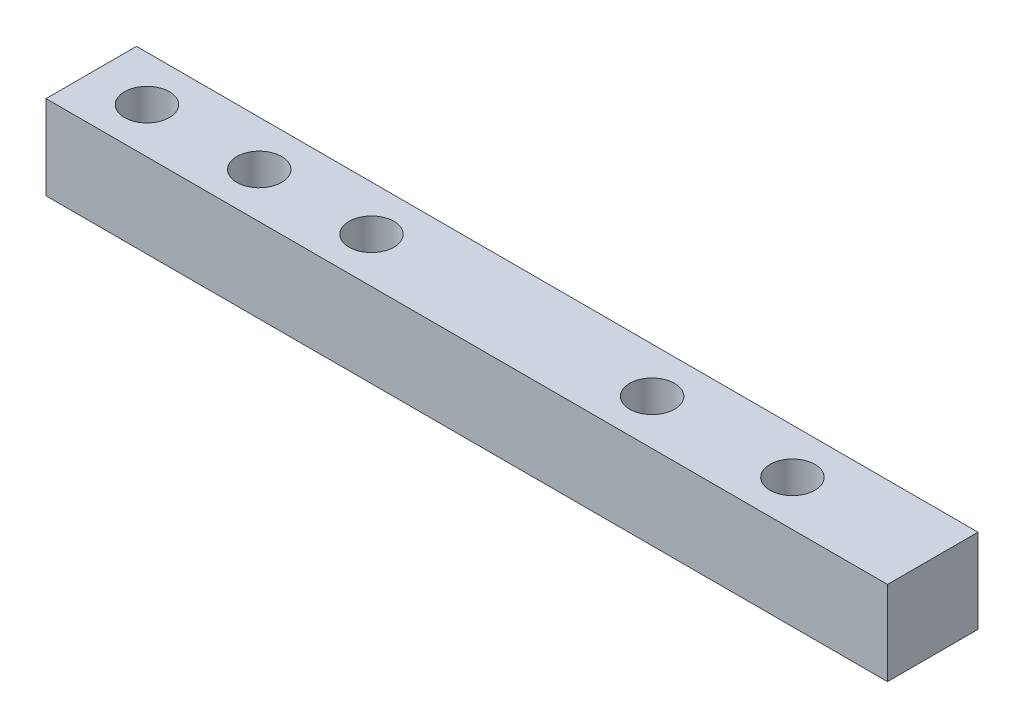
ISO-10303-21;
HEADER;
FILE_DESCRIPTION(('STEP AP214'),'2;1');
FILE_NAME('part.step','',(''),(''),'','','');
FILE_SCHEMA(('AUTOMOTIVE_DESIGN { 1 0 10303 214 1 1 1 1 }'));
ENDSEC;
DATA;
#1=APPLICATION_CONTEXT('core data for automotive mechanical design processes');
#2=APPLICATION_PROTOCOL_DEFINITION('international standard','automotive_design',2000,#1);
#3=PRODUCT_CONTEXT('',#1,'mechanical');
#4=PRODUCT('Part','Part','',(#3));
#5=PRODUCT_RELATED_PRODUCT_CATEGORY('part','',(#4));
#6=PRODUCT_DEFINITION_FORMATION('','',#4);
#7=PRODUCT_DEFINITION_CONTEXT('part definition',#1,'design');
#8=PRODUCT_DEFINITION('design','',#6,#7);
#9=PRODUCT_DEFINITION_SHAPE('','',#8);
#10=(LENGTH_UNIT() NAMED_UNIT(*) SI_UNIT(.MILLI.,.METRE.));
#11=(NAMED_UNIT(*) PLANE_ANGLE_UNIT() SI_UNIT($,.RADIAN.));
#12=(NAMED_UNIT(*) SI_UNIT($,.STERADIAN.) SOLID_ANGLE_UNIT());
#13=UNCERTAINTY_MEASURE_WITH_UNIT(LENGTH_MEASURE(1.E-05),#10,'distance_accuracy_value','');
#14=(GEOMETRIC_REPRESENTATION_CONTEXT(3) GLOBAL_UNCERTAINTY_ASSIGNED_CONTEXT((#13)) GLOBAL_UNIT_ASSIGNED_CONTEXT((#10,
#11,#12)) REPRESENTATION_CONTEXT('',''));
#15=CARTESIAN_POINT('',(0.,0.,0.));
#16=DIRECTION('',(0.,0.,1.));
#17=DIRECTION('',(1.,0.,0.));
#18=AXIS2_PLACEMENT_3D('',#15,#16,#17);
#19=CARTESIAN_POINT('',(0.,1.5,-39.2381900419911));
#20=DIRECTION('',(0.,0.,-1.));
#21=DIRECTION('',(-1.,0.,0.));
#22=AXIS2_PLACEMENT_3D('',#19,#20,#21);
#23=PLANE('',#22);
#24=DIRECTION('',(1.,0.,0.));
#25=VECTOR('',#24,1.);
#26=CARTESIAN_POINT('',(0.,0.,-39.2381900419911));
#27=LINE('',#26,#25);
#28=CARTESIAN_POINT('',(-55.2942697301901,0.,-39.2381900419911));
#29=VERTEX_POINT('',#28);
#30=CARTESIAN_POINT('',(-40.3015658329497,0.,-39.2381900419911));
#31=VERTEX_POINT('',#30);
#32=EDGE_CURVE('E129',#29,#31,#27,.T.);
#33=ORIENTED_EDGE('',*,*,#32,.T.);
#34=DIRECTION('',(0.,-1.,0.));
#35=VECTOR('',#34,1.);
#36=CARTESIAN_POINT('',(-40.3015658329497,1.5,-39.2381900419911));
#37=LINE('',#36,#35);
#38=CARTESIAN_POINT('',(-40.3015658329497,1.5,-39.2381900419911));
#39=VERTEX_POINT('',#38);
#40=EDGE_CURVE('E11',#39,#31,#37,.T.);
#41=ORIENTED_EDGE('',*,*,#40,.F.);
#42=DIRECTION('',(1.,0.,0.));
#43=VECTOR('',#42,1.);
#44=CARTESIAN_POINT('',(0.,1.5,-39.2381900419911));
#45=LINE('',#44,#43);
#46=CARTESIAN_POINT('',(-55.2942697301901,1.5,-39.2381900419911));
#47=VERTEX_POINT('',#46);
#48=EDGE_CURVE('E81',#47,#39,#45,.T.);
#49=ORIENTED_EDGE('',*,*,#48,.F.);
#50=DIRECTION('',(0.,-1.,0.));
#51=VECTOR('',#50,1.);
#52=CARTESIAN_POINT('',(-55.2942697301901,1.5,-39.2381900419911));
#53=LINE('',#52,#51);
#54=EDGE_CURVE('E128',#47,#29,#53,.T.);
#55=ORIENTED_EDGE('',*,*,#54,.T.);
#56=EDGE_LOOP('',(#33,#41,#49,#55));
#57=FACE_BOUND('',#56,.T.);
#58=ADVANCED_FACE('F41',(#57),#23,.F.);
#59=CARTESIAN_POINT('',(-40.3015658329497,1.5,0.));
#60=DIRECTION('',(1.,0.,0.));
#61=DIRECTION('',(0.,0.,-1.));
#62=AXIS2_PLACEMENT_3D('',#59,#60,#61);
#63=PLANE('',#62);
#64=DIRECTION('',(0.,0.,1.));
#65=VECTOR('',#64,1.);
#66=CARTESIAN_POINT('',(-40.3015658329497,0.,0.));
#67=LINE('',#66,#65);
#68=CARTESIAN_POINT('',(-40.3015658329497,0.,-40.8506415916508));
#69=VERTEX_POINT('',#68);
#70=EDGE_CURVE('E90',#69,#31,#67,.T.);
#71=ORIENTED_EDGE('',*,*,#70,.F.);
#72=DIRECTION('',(0.,-1.,0.));
#73=VECTOR('',#72,1.);
#74=CARTESIAN_POINT('',(-40.3015658329497,1.5,-40.8506415916508));
#75=LINE('',#74,#73);
#76=CARTESIAN_POINT('',(-40.3015658329497,1.5,-40.8506415916508));
#77=VERTEX_POINT('',#76);
#78=EDGE_CURVE('E50',#77,#69,#75,.T.);
#79=ORIENTED_EDGE('',*,*,#78,.F.);
#80=DIRECTION('',(0.,0.,1.));
#81=VECTOR('',#80,1.);
#82=CARTESIAN_POINT('',(-40.3015658329497,1.5,0.));
#83=LINE('',#82,#81);
#84=EDGE_CURVE('E88',#77,#39,#83,.T.);
#85=ORIENTED_EDGE('',*,*,#84,.T.);
#86=ORIENTED_EDGE('',*,*,#40,.T.);
#87=EDGE_LOOP('',(#71,#79,#85,#86));
#88=FACE_BOUND('',#87,.T.);
#89=ADVANCED_FACE('F87',(#88),#63,.T.);
#90=CARTESIAN_POINT('',(0.,1.5,-40.8506415916507));
#91=DIRECTION('',(0.,0.,-1.));
#92=DIRECTION('',(-1.,0.,0.));
#93=AXIS2_PLACEMENT_3D('',#90,#91,#92);
#94=PLANE('',#93);
#95=DIRECTION('',(1.,0.,0.));
#96=VECTOR('',#95,1.);
#97=CARTESIAN_POINT('',(0.,0.,-40.8506415916507));
#98=LINE('',#97,#96);
#99=CARTESIAN_POINT('',(-55.2942697301901,0.,-40.8506415916508));
#100=VERTEX_POINT('',#99);
#101=EDGE_CURVE('E135',#100,#69,#98,.T.);
#102=ORIENTED_EDGE('',*,*,#101,.F.);
#103=DIRECTION('',(0.,-1.,0.));
#104=VECTOR('',#103,1.);
#105=CARTESIAN_POINT('',(-55.2942697301901,1.5,-40.8506415916508));
#106=LINE('',#105,#104);
#107=CARTESIAN_POINT('',(-55.2942697301901,1.5,-40.8506415916508));
#108=VERTEX_POINT('',#107);
#109=EDGE_CURVE('E73',#108,#100,#106,.T.);
#110=ORIENTED_EDGE('',*,*,#109,.F.);
#111=DIRECTION('',(1.,0.,0.));
#112=VECTOR('',#111,1.);
#113=CARTESIAN_POINT('',(0.,1.5,-40.8506415916507));
#114=LINE('',#113,#112);
#115=EDGE_CURVE('E98',#108,#77,#114,.T.);
#116=ORIENTED_EDGE('',*,*,#115,.T.);
#117=ORIENTED_EDGE('',*,*,#78,.T.);
#118=EDGE_LOOP('',(#102,#110,#116,#117));
#119=FACE_BOUND('',#118,.T.);
#120=ADVANCED_FACE('F101',(#119),#94,.T.);
#121=CARTESIAN_POINT('',(-54.3015658329497,1.5,-40.0444158168209));
#122=DIRECTION('',(0.,-1.,0.));
#123=DIRECTION('',(0.,0.,-1.));
#124=AXIS2_PLACEMENT_3D('',#121,#122,#123);
#125=CYLINDRICAL_SURFACE('',#124,0.399999999999997);
#126=CARTESIAN_POINT('',(-54.3015658329497,1.5,-40.0444158168209));
#127=DIRECTION('',(0.,1.,0.));
#128=DIRECTION('',(0.,0.,1.));
#129=AXIS2_PLACEMENT_3D('',#126,#127,#128);
#130=CIRCLE('',#129,0.399999999999997);
#131=CARTESIAN_POINT('',(-54.3015658329497,1.5,-39.6444158168209));
#132=VERTEX_POINT('',#131);
#133=EDGE_CURVE('E120',#132,#132,#130,.T.);
#134=ORIENTED_EDGE('',*,*,#133,.T.);
#135=EDGE_LOOP('',(#134));
#136=FACE_BOUND('',#135,.T.);
#137=CARTESIAN_POINT('',(-54.3015658329497,0.,-40.0444158168209));
#138=DIRECTION('',(0.,1.,0.));
#139=DIRECTION('',(0.,0.,1.));
#140=AXIS2_PLACEMENT_3D('',#137,#138,#139);
#141=CIRCLE('',#140,0.399999999999997);
#142=CARTESIAN_POINT('',(-54.3015658329497,0.,-39.6444158168209));
#143=VERTEX_POINT('',#142);
#144=EDGE_CURVE('E152',#143,#143,#141,.T.);
#145=ORIENTED_EDGE('',*,*,#144,.F.);
#146=EDGE_LOOP('',(#145));
#147=FACE_BOUND('',#146,.T.);
#148=ADVANCED_FACE('F200',(#136,#147),#125,.F.);
#149=CARTESIAN_POINT('',(-52.3015658329497,1.5,-40.0444158168209));
#150=DIRECTION('',(0.,-1.,0.));
#151=DIRECTION('',(0.,0.,-1.));
#152=AXIS2_PLACEMENT_3D('',#149,#150,#151);
#153=CYLINDRICAL_SURFACE('',#152,0.399999999999997);
#154=CARTESIAN_POINT('',(-52.3015658329497,1.5,-40.0444158168209));
#155=DIRECTION('',(0.,1.,0.));
#156=DIRECTION('',(0.,0.,1.));
#157=AXIS2_PLACEMENT_3D('',#154,#155,#156);
#158=CIRCLE('',#157,0.399999999999997);
#159=CARTESIAN_POINT('',(-52.3015658329497,1.5,-39.6444158168209));
#160=VERTEX_POINT('',#159);
#161=EDGE_CURVE('E116',#160,#160,#158,.T.);
#162=ORIENTED_EDGE('',*,*,#161,.T.);
#163=EDGE_LOOP('',(#162));
#164=FACE_BOUND('',#163,.T.);
#165=CARTESIAN_POINT('',(-52.3015658329497,0.,-40.0444158168209));
#166=DIRECTION('',(0.,1.,0.));
#167=DIRECTION('',(0.,0.,1.));
#168=AXIS2_PLACEMENT_3D('',#165,#166,#167);
#169=CIRCLE('',#168,0.399999999999997);
#170=CARTESIAN_POINT('',(-52.3015658329497,0.,-39.6444158168209));
#171=VERTEX_POINT('',#170);
#172=EDGE_CURVE('E148',#171,#171,#169,.T.);
#173=ORIENTED_EDGE('',*,*,#172,.F.);
#174=EDGE_LOOP('',(#173));
#175=FACE_BOUND('',#174,.T.);
#176=ADVANCED_FACE('F209',(#164,#175),#153,.F.);
#177=CARTESIAN_POINT('',(-50.3015658329497,1.5,-40.0444158168209));
#178=DIRECTION('',(0.,-1.,0.));
#179=DIRECTION('',(0.,0.,-1.));
#180=AXIS2_PLACEMENT_3D('',#177,#178,#179);
#181=CYLINDRICAL_SURFACE('',#180,0.399999999999997);
#182=CARTESIAN_POINT('',(-50.3015658329497,1.5,-40.0444158168209));
#183=DIRECTION('',(0.,1.,0.));
#184=DIRECTION('',(0.,0.,1.));
#185=AXIS2_PLACEMENT_3D('',#182,#183,#184);
#186=CIRCLE('',#185,0.399999999999997);
#187=CARTESIAN_POINT('',(-50.3015658329497,1.5,-39.6444158168209));
#188=VERTEX_POINT('',#187);
#189=EDGE_CURVE('E112',#188,#188,#186,.T.);
#190=ORIENTED_EDGE('',*,*,#189,.T.);
#191=EDGE_LOOP('',(#190));
#192=FACE_BOUND('',#191,.T.);
#193=CARTESIAN_POINT('',(-50.3015658329497,0.,-40.0444158168209));
#194=DIRECTION('',(0.,1.,0.));
#195=DIRECTION('',(0.,0.,1.));
#196=AXIS2_PLACEMENT_3D('',#193,#194,#195);
#197=CIRCLE('',#196,0.399999999999997);
#198=CARTESIAN_POINT('',(-50.3015658329497,0.,-39.6444158168209));
#199=VERTEX_POINT('',#198);
#200=EDGE_CURVE('E144',#199,#199,#197,.T.);
#201=ORIENTED_EDGE('',*,*,#200,.F.);
#202=EDGE_LOOP('',(#201));
#203=FACE_BOUND('',#202,.T.);
#204=ADVANCED_FACE('F205',(#192,#203),#181,.F.);
#205=CARTESIAN_POINT('',(-45.3015658329497,1.5,-40.0444158168209));
#206=DIRECTION('',(0.,-1.,0.));
#207=DIRECTION('',(0.,0.,-1.));
#208=AXIS2_PLACEMENT_3D('',#205,#206,#207);
#209=CYLINDRICAL_SURFACE('',#208,0.399999999999997);
#210=CARTESIAN_POINT('',(-45.3015658329497,1.5,-40.0444158168209));
#211=DIRECTION('',(0.,1.,0.));
#212=DIRECTION('',(0.,0.,1.));
#213=AXIS2_PLACEMENT_3D('',#210,#211,#212);
#214=CIRCLE('',#213,0.399999999999997);
#215=CARTESIAN_POINT('',(-45.3015658329497,1.5,-39.6444158168209));
#216=VERTEX_POINT('',#215);
#217=EDGE_CURVE('E105',#216,#216,#214,.T.);
#218=ORIENTED_EDGE('',*,*,#217,.T.);
#219=EDGE_LOOP('',(#218));
#220=FACE_BOUND('',#219,.T.);
#221=CARTESIAN_POINT('',(-45.3015658329497,0.,-40.0444158168209));
#222=DIRECTION('',(0.,1.,0.));
#223=DIRECTION('',(0.,0.,1.));
#224=AXIS2_PLACEMENT_3D('',#221,#222,#223);
#225=CIRCLE('',#224,0.399999999999997);
#226=CARTESIAN_POINT('',(-45.3015658329497,0.,-39.6444158168209));
#227=VERTEX_POINT('',#226);
#228=EDGE_CURVE('E140',#227,#227,#225,.T.);
#229=ORIENTED_EDGE('',*,*,#228,.F.);
#230=EDGE_LOOP('',(#229));
#231=FACE_BOUND('',#230,.T.);
#232=ADVANCED_FACE('F190',(#220,#231),#209,.F.);
#233=CARTESIAN_POINT('',(-55.2942697301901,1.5,0.));
#234=DIRECTION('',(1.,0.,0.));
#235=DIRECTION('',(0.,0.,-1.));
#236=AXIS2_PLACEMENT_3D('',#233,#234,#235);
#237=PLANE('',#236);
#238=DIRECTION('',(0.,0.,1.));
#239=VECTOR('',#238,1.);
#240=CARTESIAN_POINT('',(-55.2942697301901,0.,0.));
#241=LINE('',#240,#239);
#242=EDGE_CURVE('E76',#100,#29,#241,.T.);
#243=ORIENTED_EDGE('',*,*,#242,.T.);
#244=ORIENTED_EDGE('',*,*,#54,.F.);
#245=DIRECTION('',(0.,0.,1.));
#246=VECTOR('',#245,1.);
#247=CARTESIAN_POINT('',(-55.2942697301901,1.5,0.));
#248=LINE('',#247,#246);
#249=EDGE_CURVE('E58',#108,#47,#248,.T.);
#250=ORIENTED_EDGE('',*,*,#249,.F.);
#251=ORIENTED_EDGE('',*,*,#109,.T.);
#252=EDGE_LOOP('',(#243,#244,#250,#251));
#253=FACE_BOUND('',#252,.T.);
#254=ADVANCED_FACE('F182',(#253),#237,.F.);
#255=CARTESIAN_POINT('',(-42.8015658329497,1.5,-40.0444158168209));
#256=DIRECTION('',(0.,-1.,0.));
#257=DIRECTION('',(0.,0.,-1.));
#258=AXIS2_PLACEMENT_3D('',#255,#256,#257);
#259=CYLINDRICAL_SURFACE('',#258,0.399999999999997);
#260=CARTESIAN_POINT('',(-42.8015658329497,1.5,-40.0444158168209));
#261=DIRECTION('',(0.,1.,0.));
#262=DIRECTION('',(0.,0.,1.));
#263=AXIS2_PLACEMENT_3D('',#260,#261,#262);
#264=CIRCLE('',#263,0.399999999999997);
#265=CARTESIAN_POINT('',(-42.8015658329497,1.5,-39.6444158168209));
#266=VERTEX_POINT('',#265);
#267=EDGE_CURVE('E124',#266,#266,#264,.T.);
#268=ORIENTED_EDGE('',*,*,#267,.T.);
#269=EDGE_LOOP('',(#268));
#270=FACE_BOUND('',#269,.T.);
#271=CARTESIAN_POINT('',(-42.8015658329497,0.,-40.0444158168209));
#272=DIRECTION('',(0.,1.,0.));
#273=DIRECTION('',(0.,0.,1.));
#274=AXIS2_PLACEMENT_3D('',#271,#272,#273);
#275=CIRCLE('',#274,0.399999999999997);
#276=CARTESIAN_POINT('',(-42.8015658329497,0.,-39.6444158168209));
#277=VERTEX_POINT('',#276);
#278=EDGE_CURVE('E156',#277,#277,#275,.T.);
#279=ORIENTED_EDGE('',*,*,#278,.F.);
#280=EDGE_LOOP('',(#279));
#281=FACE_BOUND('',#280,.T.);
#282=ADVANCED_FACE('F180',(#270,#281),#259,.F.);
#283=CARTESIAN_POINT('',(0.,1.5,0.));
#284=DIRECTION('',(0.,1.,0.));
#285=DIRECTION('',(0.,0.,1.));
#286=AXIS2_PLACEMENT_3D('',#283,#284,#285);
#287=PLANE('',#286);
#288=ORIENTED_EDGE('',*,*,#48,.T.);
#289=ORIENTED_EDGE('',*,*,#84,.F.);
#290=ORIENTED_EDGE('',*,*,#115,.F.);
#291=ORIENTED_EDGE('',*,*,#249,.T.);
#292=EDGE_LOOP('',(#288,#289,#290,#291));
#293=FACE_BOUND('',#292,.T.);
#294=ORIENTED_EDGE('',*,*,#217,.F.);
#295=EDGE_LOOP('',(#294));
#296=FACE_BOUND('',#295,.T.);
#297=ORIENTED_EDGE('',*,*,#189,.F.);
#298=EDGE_LOOP('',(#297));
#299=FACE_BOUND('',#298,.T.);
#300=ORIENTED_EDGE('',*,*,#161,.F.);
#301=EDGE_LOOP('',(#300));
#302=FACE_BOUND('',#301,.T.);
#303=ORIENTED_EDGE('',*,*,#133,.F.);
#304=EDGE_LOOP('',(#303));
#305=FACE_BOUND('',#304,.T.);
#306=ORIENTED_EDGE('',*,*,#267,.F.);
#307=EDGE_LOOP('',(#306));
#308=FACE_BOUND('',#307,.T.);
#309=ADVANCED_FACE('F96',(#293,#296,#299,#302,#305,#308),#287,.T.);
#310=CARTESIAN_POINT('',(0.,0.,0.));
#311=DIRECTION('',(0.,1.,0.));
#312=DIRECTION('',(0.,0.,1.));
#313=AXIS2_PLACEMENT_3D('',#310,#311,#312);
#314=PLANE('',#313);
#315=ORIENTED_EDGE('',*,*,#32,.F.);
#316=ORIENTED_EDGE('',*,*,#242,.F.);
#317=ORIENTED_EDGE('',*,*,#101,.T.);
#318=ORIENTED_EDGE('',*,*,#70,.T.);
#319=EDGE_LOOP('',(#315,#316,#317,#318));
#320=FACE_BOUND('',#319,.T.);
#321=ORIENTED_EDGE('',*,*,#228,.T.);
#322=EDGE_LOOP('',(#321));
#323=FACE_BOUND('',#322,.T.);
#324=ORIENTED_EDGE('',*,*,#200,.T.);
#325=EDGE_LOOP('',(#324));
#326=FACE_BOUND('',#325,.T.);
#327=ORIENTED_EDGE('',*,*,#172,.T.);
#328=EDGE_LOOP('',(#327));
#329=FACE_BOUND('',#328,.T.);
#330=ORIENTED_EDGE('',*,*,#144,.T.);
#331=EDGE_LOOP('',(#330));
#332=FACE_BOUND('',#331,.T.);
#333=ORIENTED_EDGE('',*,*,#278,.T.);
#334=EDGE_LOOP('',(#333));
#335=FACE_BOUND('',#334,.T.);
#336=ADVANCED_FACE('F166',(#320,#323,#326,#329,#332,#335),#314,.F.);
#337=CLOSED_SHELL('',(#58,#89,#120,#148,#176,#204,#232,#254,#282,#309,#336));
#338=MANIFOLD_SOLID_BREP('B2',#337);
#339=ADVANCED_BREP_SHAPE_REPRESENTATION('',(#18,#338),#14);
#340=SHAPE_DEFINITION_REPRESENTATION(#9,#339);
ENDSEC;
END-ISO-10303-21;
